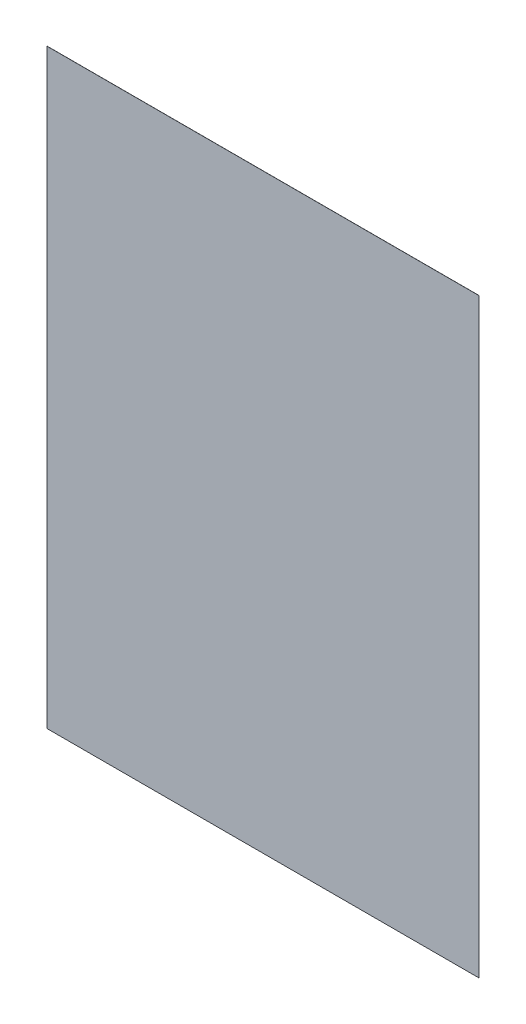
ISO-10303-21;
HEADER;
FILE_DESCRIPTION(('STEP AP214'),'2;1');
FILE_NAME('part.step','',(''),(''),'','','');
FILE_SCHEMA(('AUTOMOTIVE_DESIGN { 1 0 10303 214 1 1 1 1 }'));
ENDSEC;
DATA;
#1=APPLICATION_CONTEXT('core data for automotive mechanical design processes');
#2=APPLICATION_PROTOCOL_DEFINITION('international standard','automotive_design',2000,#1);
#3=PRODUCT_CONTEXT('',#1,'mechanical');
#4=PRODUCT('Part','Part','',(#3));
#5=PRODUCT_RELATED_PRODUCT_CATEGORY('part','',(#4));
#6=PRODUCT_DEFINITION_FORMATION('','',#4);
#7=PRODUCT_DEFINITION_CONTEXT('part definition',#1,'design');
#8=PRODUCT_DEFINITION('design','',#6,#7);
#9=PRODUCT_DEFINITION_SHAPE('','',#8);
#10=(LENGTH_UNIT() NAMED_UNIT(*) SI_UNIT(.MILLI.,.METRE.));
#11=(NAMED_UNIT(*) PLANE_ANGLE_UNIT() SI_UNIT($,.RADIAN.));
#12=(NAMED_UNIT(*) SI_UNIT($,.STERADIAN.) SOLID_ANGLE_UNIT());
#13=UNCERTAINTY_MEASURE_WITH_UNIT(LENGTH_MEASURE(1.E-05),#10,'distance_accuracy_value','');
#14=(GEOMETRIC_REPRESENTATION_CONTEXT(3) GLOBAL_UNCERTAINTY_ASSIGNED_CONTEXT((#13)) GLOBAL_UNIT_ASSIGNED_CONTEXT((#10,
#11,#12)) REPRESENTATION_CONTEXT('',''));
#15=CARTESIAN_POINT('',(0.,0.,0.));
#16=DIRECTION('',(0.,0.,1.));
#17=DIRECTION('',(1.,0.,0.));
#18=AXIS2_PLACEMENT_3D('',#15,#16,#17);
#19=CARTESIAN_POINT('',(640.,875.,0.3556));
#20=DIRECTION('',(-1.,0.,0.));
#21=DIRECTION('',(0.,-1.,0.));
#22=AXIS2_PLACEMENT_3D('',#19,#20,#21);
#23=PLANE('',#22);
#24=DIRECTION('',(0.,1.,0.));
#25=VECTOR('',#24,1.);
#26=CARTESIAN_POINT('',(640.,875.,0.));
#27=LINE('',#26,#25);
#28=CARTESIAN_POINT('',(640.,-875.,0.));
#29=VERTEX_POINT('',#28);
#30=CARTESIAN_POINT('',(640.,875.,0.));
#31=VERTEX_POINT('',#30);
#32=EDGE_CURVE('E104',#29,#31,#27,.T.);
#33=ORIENTED_EDGE('',*,*,#32,.T.);
#34=DIRECTION('',(0.,0.,-1.));
#35=VECTOR('',#34,1.);
#36=CARTESIAN_POINT('',(640.,875.,0.3556));
#37=LINE('',#36,#35);
#38=CARTESIAN_POINT('',(640.,875.,0.3556));
#39=VERTEX_POINT('',#38);
#40=EDGE_CURVE('E11',#39,#31,#37,.T.);
#41=ORIENTED_EDGE('',*,*,#40,.F.);
#42=DIRECTION('',(0.,1.,0.));
#43=VECTOR('',#42,1.);
#44=CARTESIAN_POINT('',(640.,875.,0.3556));
#45=LINE('',#44,#43);
#46=CARTESIAN_POINT('',(640.,-875.,0.3556));
#47=VERTEX_POINT('',#46);
#48=EDGE_CURVE('E92',#47,#39,#45,.T.);
#49=ORIENTED_EDGE('',*,*,#48,.F.);
#50=DIRECTION('',(0.,0.,-1.));
#51=VECTOR('',#50,1.);
#52=CARTESIAN_POINT('',(640.,-875.,0.3556));
#53=LINE('',#52,#51);
#54=EDGE_CURVE('E100',#47,#29,#53,.T.);
#55=ORIENTED_EDGE('',*,*,#54,.T.);
#56=EDGE_LOOP('',(#33,#41,#49,#55));
#57=FACE_BOUND('',#56,.T.);
#58=ADVANCED_FACE('F41',(#57),#23,.F.);
#59=CARTESIAN_POINT('',(-640.,875.,0.3556));
#60=DIRECTION('',(0.,-1.,0.));
#61=DIRECTION('',(0.,0.,-1.));
#62=AXIS2_PLACEMENT_3D('',#59,#60,#61);
#63=PLANE('',#62);
#64=DIRECTION('',(-1.,0.,0.));
#65=VECTOR('',#64,1.);
#66=CARTESIAN_POINT('',(-640.,875.,0.));
#67=LINE('',#66,#65);
#68=CARTESIAN_POINT('',(-640.,875.,0.));
#69=VERTEX_POINT('',#68);
#70=EDGE_CURVE('E96',#31,#69,#67,.T.);
#71=ORIENTED_EDGE('',*,*,#70,.T.);
#72=DIRECTION('',(0.,0.,-1.));
#73=VECTOR('',#72,1.);
#74=CARTESIAN_POINT('',(-640.,875.,0.3556));
#75=LINE('',#74,#73);
#76=CARTESIAN_POINT('',(-640.,875.,0.3556));
#77=VERTEX_POINT('',#76);
#78=EDGE_CURVE('E49',#77,#69,#75,.T.);
#79=ORIENTED_EDGE('',*,*,#78,.F.);
#80=DIRECTION('',(-1.,0.,0.));
#81=VECTOR('',#80,1.);
#82=CARTESIAN_POINT('',(-640.,875.,0.3556));
#83=LINE('',#82,#81);
#84=EDGE_CURVE('E87',#39,#77,#83,.T.);
#85=ORIENTED_EDGE('',*,*,#84,.F.);
#86=ORIENTED_EDGE('',*,*,#40,.T.);
#87=EDGE_LOOP('',(#71,#79,#85,#86));
#88=FACE_BOUND('',#87,.T.);
#89=ADVANCED_FACE('F95',(#88),#63,.F.);
#90=CARTESIAN_POINT('',(-640.,875.,0.3556));
#91=DIRECTION('',(1.,0.,0.));
#92=DIRECTION('',(0.,1.,0.));
#93=AXIS2_PLACEMENT_3D('',#90,#91,#92);
#94=PLANE('',#93);
#95=DIRECTION('',(0.,-1.,0.));
#96=VECTOR('',#95,1.);
#97=CARTESIAN_POINT('',(-640.,875.,0.));
#98=LINE('',#97,#96);
#99=CARTESIAN_POINT('',(-640.,-875.,0.));
#100=VERTEX_POINT('',#99);
#101=EDGE_CURVE('E74',#69,#100,#98,.T.);
#102=ORIENTED_EDGE('',*,*,#101,.T.);
#103=DIRECTION('',(0.,0.,-1.));
#104=VECTOR('',#103,1.);
#105=CARTESIAN_POINT('',(-640.,-875.,0.3556));
#106=LINE('',#105,#104);
#107=CARTESIAN_POINT('',(-640.,-875.,0.3556));
#108=VERTEX_POINT('',#107);
#109=EDGE_CURVE('E97',#108,#100,#106,.T.);
#110=ORIENTED_EDGE('',*,*,#109,.F.);
#111=DIRECTION('',(0.,-1.,0.));
#112=VECTOR('',#111,1.);
#113=CARTESIAN_POINT('',(-640.,875.,0.3556));
#114=LINE('',#113,#112);
#115=EDGE_CURVE('E90',#77,#108,#114,.T.);
#116=ORIENTED_EDGE('',*,*,#115,.F.);
#117=ORIENTED_EDGE('',*,*,#78,.T.);
#118=EDGE_LOOP('',(#102,#110,#116,#117));
#119=FACE_BOUND('',#118,.T.);
#120=ADVANCED_FACE('F98',(#119),#94,.F.);
#121=CARTESIAN_POINT('',(-640.,-875.,0.3556));
#122=DIRECTION('',(0.,1.,0.));
#123=DIRECTION('',(0.,0.,1.));
#124=AXIS2_PLACEMENT_3D('',#121,#122,#123);
#125=PLANE('',#124);
#126=DIRECTION('',(1.,0.,0.));
#127=VECTOR('',#126,1.);
#128=CARTESIAN_POINT('',(-640.,-875.,0.));
#129=LINE('',#128,#127);
#130=EDGE_CURVE('E80',#100,#29,#129,.T.);
#131=ORIENTED_EDGE('',*,*,#130,.T.);
#132=ORIENTED_EDGE('',*,*,#54,.F.);
#133=DIRECTION('',(1.,0.,0.));
#134=VECTOR('',#133,1.);
#135=CARTESIAN_POINT('',(-640.,-875.,0.3556));
#136=LINE('',#135,#134);
#137=EDGE_CURVE('E57',#108,#47,#136,.T.);
#138=ORIENTED_EDGE('',*,*,#137,.F.);
#139=ORIENTED_EDGE('',*,*,#109,.T.);
#140=EDGE_LOOP('',(#131,#132,#138,#139));
#141=FACE_BOUND('',#140,.T.);
#142=ADVANCED_FACE('F111',(#141),#125,.F.);
#143=CARTESIAN_POINT('',(0.,0.,0.3556));
#144=DIRECTION('',(0.,0.,1.));
#145=DIRECTION('',(1.,0.,0.));
#146=AXIS2_PLACEMENT_3D('',#143,#144,#145);
#147=PLANE('',#146);
#148=ORIENTED_EDGE('',*,*,#48,.T.);
#149=ORIENTED_EDGE('',*,*,#84,.T.);
#150=ORIENTED_EDGE('',*,*,#115,.T.);
#151=ORIENTED_EDGE('',*,*,#137,.T.);
#152=EDGE_LOOP('',(#148,#149,#150,#151));
#153=FACE_BOUND('',#152,.T.);
#154=ADVANCED_FACE('F88',(#153),#147,.T.);
#155=CARTESIAN_POINT('',(0.,0.,0.));
#156=DIRECTION('',(0.,0.,1.));
#157=DIRECTION('',(1.,0.,0.));
#158=AXIS2_PLACEMENT_3D('',#155,#156,#157);
#159=PLANE('',#158);
#160=ORIENTED_EDGE('',*,*,#32,.F.);
#161=ORIENTED_EDGE('',*,*,#130,.F.);
#162=ORIENTED_EDGE('',*,*,#101,.F.);
#163=ORIENTED_EDGE('',*,*,#70,.F.);
#164=EDGE_LOOP('',(#160,#161,#162,#163));
#165=FACE_BOUND('',#164,.T.);
#166=ADVANCED_FACE('F114',(#165),#159,.F.);
#167=CLOSED_SHELL('',(#58,#89,#120,#142,#154,#166));
#168=MANIFOLD_SOLID_BREP('B2',#167);
#169=ADVANCED_BREP_SHAPE_REPRESENTATION('',(#18,#168),#14);
#170=SHAPE_DEFINITION_REPRESENTATION(#9,#169);
ENDSEC;
END-ISO-10303-21;
